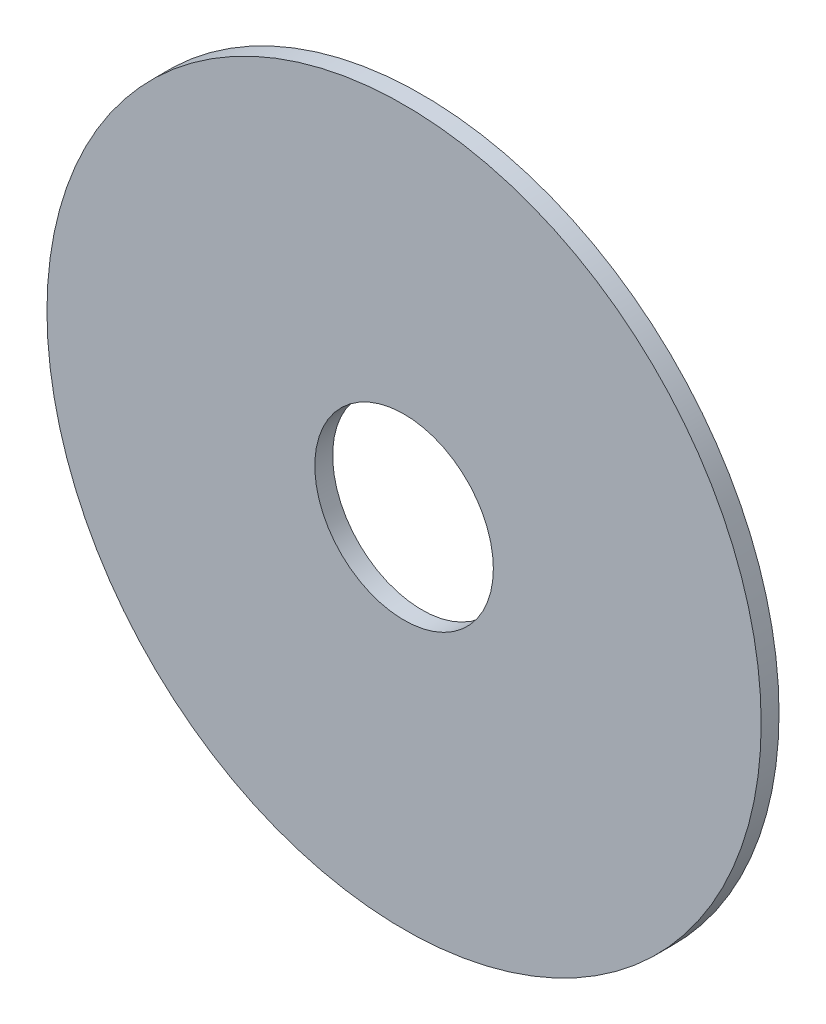
ISO-10303-21;
HEADER;
FILE_DESCRIPTION(('STEP AP214'),'2;1');
FILE_NAME('part.step','',(''),(''),'','','');
FILE_SCHEMA(('AUTOMOTIVE_DESIGN { 1 0 10303 214 1 1 1 1 }'));
ENDSEC;
DATA;
#1=APPLICATION_CONTEXT('core data for automotive mechanical design processes');
#2=APPLICATION_PROTOCOL_DEFINITION('international standard','automotive_design',2000,#1);
#3=PRODUCT_CONTEXT('',#1,'mechanical');
#4=PRODUCT('Part','Part','',(#3));
#5=PRODUCT_RELATED_PRODUCT_CATEGORY('part','',(#4));
#6=PRODUCT_DEFINITION_FORMATION('','',#4);
#7=PRODUCT_DEFINITION_CONTEXT('part definition',#1,'design');
#8=PRODUCT_DEFINITION('design','',#6,#7);
#9=PRODUCT_DEFINITION_SHAPE('','',#8);
#10=(LENGTH_UNIT() NAMED_UNIT(*) SI_UNIT(.MILLI.,.METRE.));
#11=(NAMED_UNIT(*) PLANE_ANGLE_UNIT() SI_UNIT($,.RADIAN.));
#12=(NAMED_UNIT(*) SI_UNIT($,.STERADIAN.) SOLID_ANGLE_UNIT());
#13=UNCERTAINTY_MEASURE_WITH_UNIT(LENGTH_MEASURE(1.E-05),#10,'distance_accuracy_value','');
#14=(GEOMETRIC_REPRESENTATION_CONTEXT(3) GLOBAL_UNCERTAINTY_ASSIGNED_CONTEXT((#13)) GLOBAL_UNIT_ASSIGNED_CONTEXT((#10,
#11,#12)) REPRESENTATION_CONTEXT('',''));
#15=CARTESIAN_POINT('',(0.,0.,0.));
#16=DIRECTION('',(0.,0.,1.));
#17=DIRECTION('',(1.,0.,0.));
#18=AXIS2_PLACEMENT_3D('',#15,#16,#17);
#19=CARTESIAN_POINT('',(0.,0.,5.));
#20=DIRECTION('',(0.,0.,1.));
#21=DIRECTION('',(1.,0.,0.));
#22=AXIS2_PLACEMENT_3D('',#19,#20,#21);
#23=PLANE('',#22);
#24=CARTESIAN_POINT('',(0.,0.,5.));
#25=DIRECTION('',(0.,0.,1.));
#26=DIRECTION('',(1.,0.,0.));
#27=AXIS2_PLACEMENT_3D('',#24,#25,#26);
#28=CIRCLE('',#27,100.);
#29=CARTESIAN_POINT('',(100.,0.,5.));
#30=VERTEX_POINT('',#29);
#31=EDGE_CURVE('E10',#30,#30,#28,.T.);
#32=ORIENTED_EDGE('',*,*,#31,.T.);
#33=EDGE_LOOP('',(#32));
#34=FACE_BOUND('',#33,.T.);
#35=CARTESIAN_POINT('',(0.,0.,5.));
#36=DIRECTION('',(0.,0.,1.));
#37=DIRECTION('',(1.,0.,0.));
#38=AXIS2_PLACEMENT_3D('',#35,#36,#37);
#39=CIRCLE('',#38,25.);
#40=CARTESIAN_POINT('',(25.,0.,5.));
#41=VERTEX_POINT('',#40);
#42=EDGE_CURVE('E48',#41,#41,#39,.T.);
#43=ORIENTED_EDGE('',*,*,#42,.F.);
#44=EDGE_LOOP('',(#43));
#45=FACE_BOUND('',#44,.T.);
#46=ADVANCED_FACE('F37',(#34,#45),#23,.T.);
#47=CARTESIAN_POINT('',(0.,0.,0.));
#48=DIRECTION('',(0.,0.,1.));
#49=DIRECTION('',(1.,0.,0.));
#50=AXIS2_PLACEMENT_3D('',#47,#48,#49);
#51=PLANE('',#50);
#52=CARTESIAN_POINT('',(0.,0.,0.));
#53=DIRECTION('',(0.,0.,1.));
#54=DIRECTION('',(1.,0.,0.));
#55=AXIS2_PLACEMENT_3D('',#52,#53,#54);
#56=CIRCLE('',#55,100.);
#57=CARTESIAN_POINT('',(100.,0.,0.));
#58=VERTEX_POINT('',#57);
#59=EDGE_CURVE('E41',#58,#58,#56,.T.);
#60=ORIENTED_EDGE('',*,*,#59,.F.);
#61=EDGE_LOOP('',(#60));
#62=FACE_BOUND('',#61,.T.);
#63=CARTESIAN_POINT('',(0.,0.,0.));
#64=DIRECTION('',(0.,0.,1.));
#65=DIRECTION('',(1.,0.,0.));
#66=AXIS2_PLACEMENT_3D('',#63,#64,#65);
#67=CIRCLE('',#66,25.);
#68=CARTESIAN_POINT('',(25.,0.,0.));
#69=VERTEX_POINT('',#68);
#70=EDGE_CURVE('E50',#69,#69,#67,.T.);
#71=ORIENTED_EDGE('',*,*,#70,.T.);
#72=EDGE_LOOP('',(#71));
#73=FACE_BOUND('',#72,.T.);
#74=ADVANCED_FACE('F60',(#62,#73),#51,.F.);
#75=CARTESIAN_POINT('',(0.,0.,5.));
#76=DIRECTION('',(0.,0.,-1.));
#77=DIRECTION('',(-1.,0.,0.));
#78=AXIS2_PLACEMENT_3D('',#75,#76,#77);
#79=CYLINDRICAL_SURFACE('',#78,100.);
#80=ORIENTED_EDGE('',*,*,#31,.F.);
#81=EDGE_LOOP('',(#80));
#82=FACE_BOUND('',#81,.T.);
#83=ORIENTED_EDGE('',*,*,#59,.T.);
#84=EDGE_LOOP('',(#83));
#85=FACE_BOUND('',#84,.T.);
#86=ADVANCED_FACE('F39',(#82,#85),#79,.T.);
#87=CARTESIAN_POINT('',(0.,0.,5.));
#88=DIRECTION('',(0.,0.,-1.));
#89=DIRECTION('',(-1.,0.,0.));
#90=AXIS2_PLACEMENT_3D('',#87,#88,#89);
#91=CYLINDRICAL_SURFACE('',#90,25.);
#92=ORIENTED_EDGE('',*,*,#42,.T.);
#93=EDGE_LOOP('',(#92));
#94=FACE_BOUND('',#93,.T.);
#95=ORIENTED_EDGE('',*,*,#70,.F.);
#96=EDGE_LOOP('',(#95));
#97=FACE_BOUND('',#96,.T.);
#98=ADVANCED_FACE('F56',(#94,#97),#91,.F.);
#99=CLOSED_SHELL('',(#46,#74,#86,#98));
#100=MANIFOLD_SOLID_BREP('B2',#99);
#101=ADVANCED_BREP_SHAPE_REPRESENTATION('',(#18,#100),#14);
#102=SHAPE_DEFINITION_REPRESENTATION(#9,#101);
ENDSEC;
END-ISO-10303-21;
